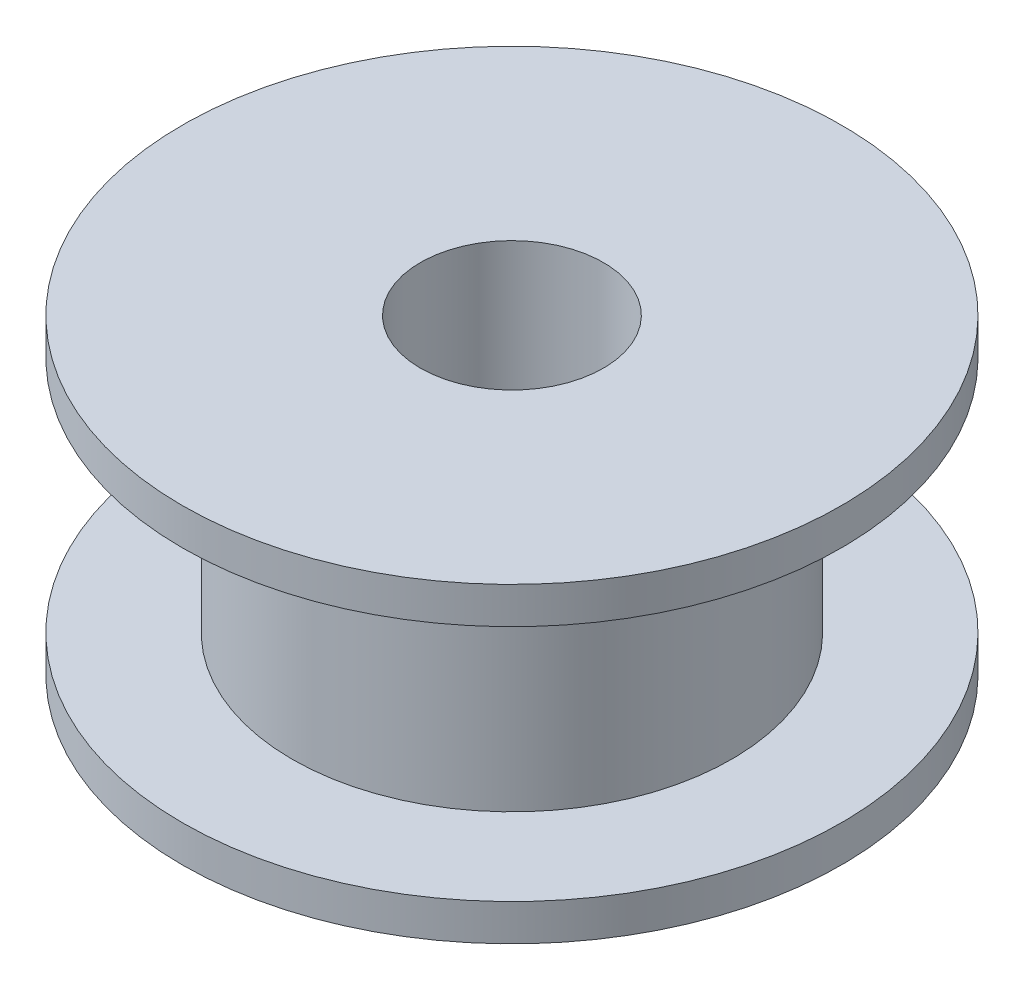
ISO-10303-21;
HEADER;
FILE_DESCRIPTION(('STEP AP214'),'2;1');
FILE_NAME('part.step','',(''),(''),'','','');
FILE_SCHEMA(('AUTOMOTIVE_DESIGN { 1 0 10303 214 1 1 1 1 }'));
ENDSEC;
DATA;
#1=APPLICATION_CONTEXT('core data for automotive mechanical design processes');
#2=APPLICATION_PROTOCOL_DEFINITION('international standard','automotive_design',2000,#1);
#3=PRODUCT_CONTEXT('',#1,'mechanical');
#4=PRODUCT('Part','Part','',(#3));
#5=PRODUCT_RELATED_PRODUCT_CATEGORY('part','',(#4));
#6=PRODUCT_DEFINITION_FORMATION('','',#4);
#7=PRODUCT_DEFINITION_CONTEXT('part definition',#1,'design');
#8=PRODUCT_DEFINITION('design','',#6,#7);
#9=PRODUCT_DEFINITION_SHAPE('','',#8);
#10=(LENGTH_UNIT() NAMED_UNIT(*) SI_UNIT(.MILLI.,.METRE.));
#11=(NAMED_UNIT(*) PLANE_ANGLE_UNIT() SI_UNIT($,.RADIAN.));
#12=(NAMED_UNIT(*) SI_UNIT($,.STERADIAN.) SOLID_ANGLE_UNIT());
#13=UNCERTAINTY_MEASURE_WITH_UNIT(LENGTH_MEASURE(1.E-05),#10,'distance_accuracy_value','');
#14=(GEOMETRIC_REPRESENTATION_CONTEXT(3) GLOBAL_UNCERTAINTY_ASSIGNED_CONTEXT((#13)) GLOBAL_UNIT_ASSIGNED_CONTEXT((#10,
#11,#12)) REPRESENTATION_CONTEXT('',''));
#15=CARTESIAN_POINT('',(0.,0.,0.));
#16=DIRECTION('',(0.,0.,1.));
#17=DIRECTION('',(1.,0.,0.));
#18=AXIS2_PLACEMENT_3D('',#15,#16,#17);
#19=CARTESIAN_POINT('',(2.5,4.25,0.));
#20=DIRECTION('',(0.,-1.,0.));
#21=DIRECTION('',(0.,0.,-1.));
#22=AXIS2_PLACEMENT_3D('',#19,#20,#21);
#23=PLANE('',#22);
#24=CARTESIAN_POINT('',(0.,4.25,0.));
#25=DIRECTION('',(0.,1.,0.));
#26=DIRECTION('',(0.,0.,1.));
#27=AXIS2_PLACEMENT_3D('',#24,#25,#26);
#28=CIRCLE('',#27,2.5);
#29=CARTESIAN_POINT('',(0.,4.25,2.5));
#30=VERTEX_POINT('',#29);
#31=EDGE_CURVE('E61',#30,#30,#28,.T.);
#32=ORIENTED_EDGE('',*,*,#31,.F.);
#33=EDGE_LOOP('',(#32));
#34=FACE_BOUND('',#33,.T.);
#35=CARTESIAN_POINT('',(0.,4.25,0.));
#36=DIRECTION('',(0.,1.,0.));
#37=DIRECTION('',(0.,0.,1.));
#38=AXIS2_PLACEMENT_3D('',#35,#36,#37);
#39=CIRCLE('',#38,9.);
#40=CARTESIAN_POINT('',(0.,4.25,9.));
#41=VERTEX_POINT('',#40);
#42=EDGE_CURVE('E10',#41,#41,#39,.T.);
#43=ORIENTED_EDGE('',*,*,#42,.T.);
#44=EDGE_LOOP('',(#43));
#45=FACE_BOUND('',#44,.T.);
#46=ADVANCED_FACE('F33',(#34,#45),#23,.F.);
#47=CARTESIAN_POINT('',(0.,55.,0.));
#48=DIRECTION('',(0.,1.,0.));
#49=DIRECTION('',(0.,0.,1.));
#50=AXIS2_PLACEMENT_3D('',#47,#48,#49);
#51=CYLINDRICAL_SURFACE('',#50,9.);
#52=ORIENTED_EDGE('',*,*,#42,.F.);
#53=EDGE_LOOP('',(#52));
#54=FACE_BOUND('',#53,.T.);
#55=CARTESIAN_POINT('',(0.,3.25,0.));
#56=DIRECTION('',(0.,1.,0.));
#57=DIRECTION('',(0.,0.,1.));
#58=AXIS2_PLACEMENT_3D('',#55,#56,#57);
#59=CIRCLE('',#58,9.);
#60=CARTESIAN_POINT('',(0.,3.25,9.));
#61=VERTEX_POINT('',#60);
#62=EDGE_CURVE('E39',#61,#61,#59,.T.);
#63=ORIENTED_EDGE('',*,*,#62,.T.);
#64=EDGE_LOOP('',(#63));
#65=FACE_BOUND('',#64,.T.);
#66=ADVANCED_FACE('F68',(#54,#65),#51,.T.);
#67=CARTESIAN_POINT('',(9.,3.25,0.));
#68=DIRECTION('',(0.,1.,0.));
#69=DIRECTION('',(0.,0.,1.));
#70=AXIS2_PLACEMENT_3D('',#67,#68,#69);
#71=PLANE('',#70);
#72=ORIENTED_EDGE('',*,*,#62,.F.);
#73=EDGE_LOOP('',(#72));
#74=FACE_BOUND('',#73,.T.);
#75=CARTESIAN_POINT('',(0.,3.25,0.));
#76=DIRECTION('',(0.,1.,0.));
#77=DIRECTION('',(0.,0.,1.));
#78=AXIS2_PLACEMENT_3D('',#75,#76,#77);
#79=CIRCLE('',#78,6.);
#80=CARTESIAN_POINT('',(0.,3.25,6.));
#81=VERTEX_POINT('',#80);
#82=EDGE_CURVE('E43',#81,#81,#79,.T.);
#83=ORIENTED_EDGE('',*,*,#82,.T.);
#84=EDGE_LOOP('',(#83));
#85=FACE_BOUND('',#84,.T.);
#86=ADVANCED_FACE('F72',(#74,#85),#71,.F.);
#87=CARTESIAN_POINT('',(0.,55.,0.));
#88=DIRECTION('',(0.,1.,0.));
#89=DIRECTION('',(0.,0.,1.));
#90=AXIS2_PLACEMENT_3D('',#87,#88,#89);
#91=CYLINDRICAL_SURFACE('',#90,6.);
#92=ORIENTED_EDGE('',*,*,#82,.F.);
#93=EDGE_LOOP('',(#92));
#94=FACE_BOUND('',#93,.T.);
#95=CARTESIAN_POINT('',(0.,-3.25,0.));
#96=DIRECTION('',(0.,1.,0.));
#97=DIRECTION('',(0.,0.,1.));
#98=AXIS2_PLACEMENT_3D('',#95,#96,#97);
#99=CIRCLE('',#98,6.);
#100=CARTESIAN_POINT('',(0.,-3.25,6.));
#101=VERTEX_POINT('',#100);
#102=EDGE_CURVE('E47',#101,#101,#99,.T.);
#103=ORIENTED_EDGE('',*,*,#102,.T.);
#104=EDGE_LOOP('',(#103));
#105=FACE_BOUND('',#104,.T.);
#106=ADVANCED_FACE('F77',(#94,#105),#91,.T.);
#107=CARTESIAN_POINT('',(6.,-3.25,0.));
#108=DIRECTION('',(0.,-1.,0.));
#109=DIRECTION('',(0.,0.,-1.));
#110=AXIS2_PLACEMENT_3D('',#107,#108,#109);
#111=PLANE('',#110);
#112=ORIENTED_EDGE('',*,*,#102,.F.);
#113=EDGE_LOOP('',(#112));
#114=FACE_BOUND('',#113,.T.);
#115=CARTESIAN_POINT('',(0.,-3.25,0.));
#116=DIRECTION('',(0.,1.,0.));
#117=DIRECTION('',(0.,0.,1.));
#118=AXIS2_PLACEMENT_3D('',#115,#116,#117);
#119=CIRCLE('',#118,9.);
#120=CARTESIAN_POINT('',(0.,-3.25,9.));
#121=VERTEX_POINT('',#120);
#122=EDGE_CURVE('E52',#121,#121,#119,.T.);
#123=ORIENTED_EDGE('',*,*,#122,.T.);
#124=EDGE_LOOP('',(#123));
#125=FACE_BOUND('',#124,.T.);
#126=ADVANCED_FACE('F83',(#114,#125),#111,.F.);
#127=CARTESIAN_POINT('',(0.,55.,0.));
#128=DIRECTION('',(0.,1.,0.));
#129=DIRECTION('',(0.,0.,1.));
#130=AXIS2_PLACEMENT_3D('',#127,#128,#129);
#131=CYLINDRICAL_SURFACE('',#130,9.);
#132=ORIENTED_EDGE('',*,*,#122,.F.);
#133=EDGE_LOOP('',(#132));
#134=FACE_BOUND('',#133,.T.);
#135=CARTESIAN_POINT('',(0.,-4.25,0.));
#136=DIRECTION('',(0.,1.,0.));
#137=DIRECTION('',(0.,0.,1.));
#138=AXIS2_PLACEMENT_3D('',#135,#136,#137);
#139=CIRCLE('',#138,9.);
#140=CARTESIAN_POINT('',(0.,-4.25,9.));
#141=VERTEX_POINT('',#140);
#142=EDGE_CURVE('E55',#141,#141,#139,.T.);
#143=ORIENTED_EDGE('',*,*,#142,.T.);
#144=EDGE_LOOP('',(#143));
#145=FACE_BOUND('',#144,.T.);
#146=ADVANCED_FACE('F87',(#134,#145),#131,.T.);
#147=CARTESIAN_POINT('',(9.,-4.25,0.));
#148=DIRECTION('',(0.,1.,0.));
#149=DIRECTION('',(0.,0.,1.));
#150=AXIS2_PLACEMENT_3D('',#147,#148,#149);
#151=PLANE('',#150);
#152=ORIENTED_EDGE('',*,*,#142,.F.);
#153=EDGE_LOOP('',(#152));
#154=FACE_BOUND('',#153,.T.);
#155=CARTESIAN_POINT('',(0.,-4.25,0.));
#156=DIRECTION('',(0.,1.,0.));
#157=DIRECTION('',(0.,0.,1.));
#158=AXIS2_PLACEMENT_3D('',#155,#156,#157);
#159=CIRCLE('',#158,2.5);
#160=CARTESIAN_POINT('',(0.,-4.25,2.5));
#161=VERTEX_POINT('',#160);
#162=EDGE_CURVE('E58',#161,#161,#159,.T.);
#163=ORIENTED_EDGE('',*,*,#162,.T.);
#164=EDGE_LOOP('',(#163));
#165=FACE_BOUND('',#164,.T.);
#166=ADVANCED_FACE('F91',(#154,#165),#151,.F.);
#167=CARTESIAN_POINT('',(0.,55.,0.));
#168=DIRECTION('',(0.,1.,0.));
#169=DIRECTION('',(0.,0.,1.));
#170=AXIS2_PLACEMENT_3D('',#167,#168,#169);
#171=CYLINDRICAL_SURFACE('',#170,2.5);
#172=ORIENTED_EDGE('',*,*,#162,.F.);
#173=EDGE_LOOP('',(#172));
#174=FACE_BOUND('',#173,.T.);
#175=ORIENTED_EDGE('',*,*,#31,.T.);
#176=EDGE_LOOP('',(#175));
#177=FACE_BOUND('',#176,.T.);
#178=ADVANCED_FACE('F65',(#174,#177),#171,.F.);
#179=CLOSED_SHELL('',(#46,#66,#86,#106,#126,#146,#166,#178));
#180=MANIFOLD_SOLID_BREP('B2',#179);
#181=ADVANCED_BREP_SHAPE_REPRESENTATION('',(#18,#180),#14);
#182=SHAPE_DEFINITION_REPRESENTATION(#9,#181);
ENDSEC;
END-ISO-10303-21;
